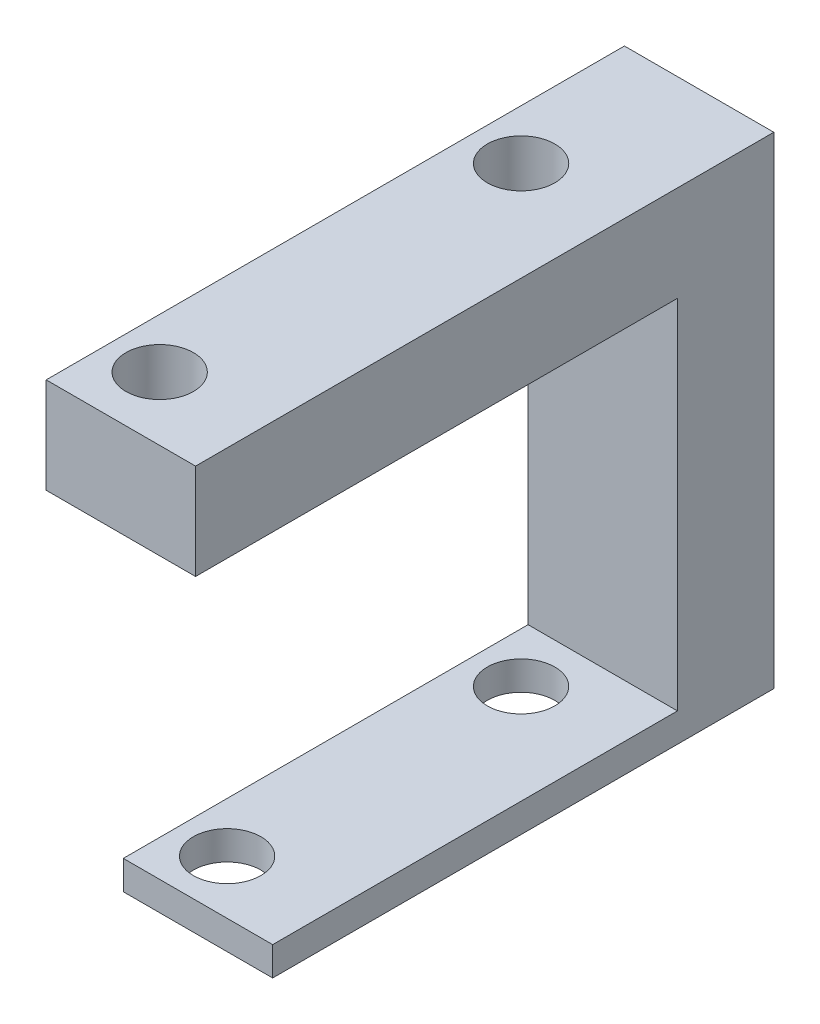
ISO-10303-21;
HEADER;
FILE_DESCRIPTION(('STEP AP214'),'2;1');
FILE_NAME('part.step','',(''),(''),'','','');
FILE_SCHEMA(('AUTOMOTIVE_DESIGN { 1 0 10303 214 1 1 1 1 }'));
ENDSEC;
DATA;
#1=APPLICATION_CONTEXT('core data for automotive mechanical design processes');
#2=APPLICATION_PROTOCOL_DEFINITION('international standard','automotive_design',2000,#1);
#3=PRODUCT_CONTEXT('',#1,'mechanical');
#4=PRODUCT('Part','Part','',(#3));
#5=PRODUCT_RELATED_PRODUCT_CATEGORY('part','',(#4));
#6=PRODUCT_DEFINITION_FORMATION('','',#4);
#7=PRODUCT_DEFINITION_CONTEXT('part definition',#1,'design');
#8=PRODUCT_DEFINITION('design','',#6,#7);
#9=PRODUCT_DEFINITION_SHAPE('','',#8);
#10=(LENGTH_UNIT() NAMED_UNIT(*) SI_UNIT(.MILLI.,.METRE.));
#11=(NAMED_UNIT(*) PLANE_ANGLE_UNIT() SI_UNIT($,.RADIAN.));
#12=(NAMED_UNIT(*) SI_UNIT($,.STERADIAN.) SOLID_ANGLE_UNIT());
#13=UNCERTAINTY_MEASURE_WITH_UNIT(LENGTH_MEASURE(1.E-05),#10,'distance_accuracy_value','');
#14=(GEOMETRIC_REPRESENTATION_CONTEXT(3) GLOBAL_UNCERTAINTY_ASSIGNED_CONTEXT((#13)) GLOBAL_UNIT_ASSIGNED_CONTEXT((#10,
#11,#12)) REPRESENTATION_CONTEXT('',''));
#15=CARTESIAN_POINT('',(0.,0.,0.));
#16=DIRECTION('',(0.,0.,1.));
#17=DIRECTION('',(1.,0.,0.));
#18=AXIS2_PLACEMENT_3D('',#15,#16,#17);
#19=CARTESIAN_POINT('',(-7.874,32.5993468484475,41.0275219428125));
#20=DIRECTION('',(0.,0.,1.));
#21=DIRECTION('',(1.,0.,0.));
#22=AXIS2_PLACEMENT_3D('',#19,#20,#21);
#23=PLANE('',#22);
#24=DIRECTION('',(0.,-1.,0.));
#25=VECTOR('',#24,1.);
#26=CARTESIAN_POINT('',(0.,32.5993468484475,41.0275219428125));
#27=LINE('',#26,#25);
#28=CARTESIAN_POINT('',(0.,32.5993468484475,41.0275219428125));
#29=VERTEX_POINT('',#28);
#30=CARTESIAN_POINT('',(0.,27.5582107378629,41.0275219428125));
#31=VERTEX_POINT('',#30);
#32=EDGE_CURVE('E130',#29,#31,#27,.T.);
#33=ORIENTED_EDGE('',*,*,#32,.F.);
#34=DIRECTION('',(1.,0.,0.));
#35=VECTOR('',#34,1.);
#36=CARTESIAN_POINT('',(-7.874,32.5993468484475,41.0275219428125));
#37=LINE('',#36,#35);
#38=CARTESIAN_POINT('',(-7.874,32.5993468484475,41.0275219428125));
#39=VERTEX_POINT('',#38);
#40=EDGE_CURVE('E11',#39,#29,#37,.T.);
#41=ORIENTED_EDGE('',*,*,#40,.F.);
#42=DIRECTION('',(0.,-1.,0.));
#43=VECTOR('',#42,1.);
#44=CARTESIAN_POINT('',(-7.874,32.5993468484475,41.0275219428125));
#45=LINE('',#44,#43);
#46=CARTESIAN_POINT('',(-7.874,27.5582107378629,41.0275219428125));
#47=VERTEX_POINT('',#46);
#48=EDGE_CURVE('E151',#39,#47,#45,.T.);
#49=ORIENTED_EDGE('',*,*,#48,.T.);
#50=DIRECTION('',(1.,0.,0.));
#51=VECTOR('',#50,1.);
#52=CARTESIAN_POINT('',(-7.874,27.5582107378629,41.0275219428125));
#53=LINE('',#52,#51);
#54=EDGE_CURVE('E88',#47,#31,#53,.T.);
#55=ORIENTED_EDGE('',*,*,#54,.T.);
#56=EDGE_LOOP('',(#33,#41,#49,#55));
#57=FACE_BOUND('',#56,.T.);
#58=ADVANCED_FACE('F32',(#57),#23,.T.);
#59=CARTESIAN_POINT('',(-7.874,32.5993468484475,41.0275219428125));
#60=DIRECTION('',(0.,1.,0.));
#61=DIRECTION('',(0.,0.,1.));
#62=AXIS2_PLACEMENT_3D('',#59,#60,#61);
#63=PLANE('',#62);
#64=CARTESIAN_POINT('',(-5.23875000000036,32.5993468484475,18.6310719428101));
#65=DIRECTION('',(0.,1.,0.));
#66=DIRECTION('',(0.,0.,1.));
#67=AXIS2_PLACEMENT_3D('',#64,#65,#66);
#68=CIRCLE('',#67,1.778);
#69=CARTESIAN_POINT('',(-5.23875000000036,32.5993468484475,20.4090719428101));
#70=VERTEX_POINT('',#69);
#71=EDGE_CURVE('E170',#70,#70,#68,.T.);
#72=ORIENTED_EDGE('',*,*,#71,.F.);
#73=EDGE_LOOP('',(#72));
#74=FACE_BOUND('',#73,.T.);
#75=CARTESIAN_POINT('',(-5.23875000000036,32.5993468484475,37.6810719428101));
#76=DIRECTION('',(0.,1.,0.));
#77=DIRECTION('',(0.,0.,1.));
#78=AXIS2_PLACEMENT_3D('',#75,#76,#77);
#79=CIRCLE('',#78,1.778);
#80=CARTESIAN_POINT('',(-5.23875000000036,32.5993468484475,39.4590719428101));
#81=VERTEX_POINT('',#80);
#82=EDGE_CURVE('E175',#81,#81,#79,.T.);
#83=ORIENTED_EDGE('',*,*,#82,.F.);
#84=EDGE_LOOP('',(#83));
#85=FACE_BOUND('',#84,.T.);
#86=DIRECTION('',(0.,0.,1.));
#87=VECTOR('',#86,1.);
#88=CARTESIAN_POINT('',(0.,32.5993468484475,41.0275219428125));
#89=LINE('',#88,#87);
#90=CARTESIAN_POINT('',(0.,32.5993468484475,10.5475219428125));
#91=VERTEX_POINT('',#90);
#92=EDGE_CURVE('E149',#91,#29,#89,.T.);
#93=ORIENTED_EDGE('',*,*,#92,.F.);
#94=DIRECTION('',(1.,0.,0.));
#95=VECTOR('',#94,1.);
#96=CARTESIAN_POINT('',(-7.874,32.5993468484475,10.5475219428125));
#97=LINE('',#96,#95);
#98=CARTESIAN_POINT('',(-7.874,32.5993468484475,10.5475219428125));
#99=VERTEX_POINT('',#98);
#100=EDGE_CURVE('E41',#99,#91,#97,.T.);
#101=ORIENTED_EDGE('',*,*,#100,.F.);
#102=DIRECTION('',(0.,0.,1.));
#103=VECTOR('',#102,1.);
#104=CARTESIAN_POINT('',(-7.874,32.5993468484475,41.0275219428125));
#105=LINE('',#104,#103);
#106=EDGE_CURVE('E120',#99,#39,#105,.T.);
#107=ORIENTED_EDGE('',*,*,#106,.T.);
#108=ORIENTED_EDGE('',*,*,#40,.T.);
#109=EDGE_LOOP('',(#93,#101,#107,#108));
#110=FACE_BOUND('',#109,.T.);
#111=ADVANCED_FACE('F204',(#74,#85,#110),#63,.T.);
#112=CARTESIAN_POINT('',(-7.874,32.5993468484475,10.5475219428125));
#113=DIRECTION('',(0.,0.,-1.));
#114=DIRECTION('',(0.,1.,0.));
#115=AXIS2_PLACEMENT_3D('',#112,#113,#114);
#116=PLANE('',#115);
#117=DIRECTION('',(0.,1.,0.));
#118=VECTOR('',#117,1.);
#119=CARTESIAN_POINT('',(0.,32.5993468484475,10.5475219428125));
#120=LINE('',#119,#118);
#121=CARTESIAN_POINT('',(0.,7.19934684844752,10.5475219428125));
#122=VERTEX_POINT('',#121);
#123=EDGE_CURVE('E107',#122,#91,#120,.T.);
#124=ORIENTED_EDGE('',*,*,#123,.F.);
#125=DIRECTION('',(1.,0.,0.));
#126=VECTOR('',#125,1.);
#127=CARTESIAN_POINT('',(-7.874,7.19934684844752,10.5475219428125));
#128=LINE('',#127,#126);
#129=CARTESIAN_POINT('',(-7.874,7.19934684844752,10.5475219428125));
#130=VERTEX_POINT('',#129);
#131=EDGE_CURVE('E102',#130,#122,#128,.T.);
#132=ORIENTED_EDGE('',*,*,#131,.F.);
#133=DIRECTION('',(0.,1.,0.));
#134=VECTOR('',#133,1.);
#135=CARTESIAN_POINT('',(-7.874,32.5993468484475,10.5475219428125));
#136=LINE('',#135,#134);
#137=EDGE_CURVE('E105',#130,#99,#136,.T.);
#138=ORIENTED_EDGE('',*,*,#137,.T.);
#139=ORIENTED_EDGE('',*,*,#100,.T.);
#140=EDGE_LOOP('',(#124,#132,#138,#139));
#141=FACE_BOUND('',#140,.T.);
#142=ADVANCED_FACE('F104',(#141),#116,.T.);
#143=CARTESIAN_POINT('',(-7.874,7.19934684844752,10.5475219428125));
#144=DIRECTION('',(0.,-1.,0.));
#145=DIRECTION('',(0.,0.,-1.));
#146=AXIS2_PLACEMENT_3D('',#143,#144,#145);
#147=PLANE('',#146);
#148=CARTESIAN_POINT('',(-5.23875000000036,7.19934684844752,18.6310719428101));
#149=DIRECTION('',(0.,-1.,0.));
#150=DIRECTION('',(0.,0.,-1.));
#151=AXIS2_PLACEMENT_3D('',#148,#149,#150);
#152=CIRCLE('',#151,1.778);
#153=CARTESIAN_POINT('',(-5.23875000000036,7.19934684844752,16.8530719428101));
#154=VERTEX_POINT('',#153);
#155=EDGE_CURVE('E134',#154,#154,#152,.F.);
#156=ORIENTED_EDGE('',*,*,#155,.T.);
#157=EDGE_LOOP('',(#156));
#158=FACE_BOUND('',#157,.T.);
#159=CARTESIAN_POINT('',(-5.23875000000036,7.19934684844752,34.1250719428101));
#160=DIRECTION('',(0.,-1.,0.));
#161=DIRECTION('',(0.,0.,-1.));
#162=AXIS2_PLACEMENT_3D('',#159,#160,#161);
#163=CIRCLE('',#162,1.778);
#164=CARTESIAN_POINT('',(-5.23875000000036,7.19934684844752,32.3470719428101));
#165=VERTEX_POINT('',#164);
#166=EDGE_CURVE('E165',#165,#165,#163,.F.);
#167=ORIENTED_EDGE('',*,*,#166,.T.);
#168=EDGE_LOOP('',(#167));
#169=FACE_BOUND('',#168,.T.);
#170=DIRECTION('',(0.,0.,-1.));
#171=VECTOR('',#170,1.);
#172=CARTESIAN_POINT('',(0.,7.19934684844752,10.5475219428125));
#173=LINE('',#172,#171);
#174=CARTESIAN_POINT('',(0.,7.19934684844752,36.9635219428125));
#175=VERTEX_POINT('',#174);
#176=EDGE_CURVE('E146',#175,#122,#173,.T.);
#177=ORIENTED_EDGE('',*,*,#176,.F.);
#178=DIRECTION('',(1.,0.,0.));
#179=VECTOR('',#178,1.);
#180=CARTESIAN_POINT('',(-7.874,7.19934684844752,36.9635219428125));
#181=LINE('',#180,#179);
#182=CARTESIAN_POINT('',(-7.874,7.19934684844752,36.9635219428125));
#183=VERTEX_POINT('',#182);
#184=EDGE_CURVE('E112',#183,#175,#181,.T.);
#185=ORIENTED_EDGE('',*,*,#184,.F.);
#186=DIRECTION('',(0.,0.,-1.));
#187=VECTOR('',#186,1.);
#188=CARTESIAN_POINT('',(-7.874,7.19934684844752,10.5475219428125));
#189=LINE('',#188,#187);
#190=EDGE_CURVE('E118',#183,#130,#189,.T.);
#191=ORIENTED_EDGE('',*,*,#190,.T.);
#192=ORIENTED_EDGE('',*,*,#131,.T.);
#193=EDGE_LOOP('',(#177,#185,#191,#192));
#194=FACE_BOUND('',#193,.T.);
#195=ADVANCED_FACE('F122',(#158,#169,#194),#147,.T.);
#196=CARTESIAN_POINT('',(-7.874,7.19934684844752,36.9635219428125));
#197=DIRECTION('',(0.,0.,1.));
#198=DIRECTION('',(1.,0.,0.));
#199=AXIS2_PLACEMENT_3D('',#196,#197,#198);
#200=PLANE('',#199);
#201=DIRECTION('',(0.,-1.,0.));
#202=VECTOR('',#201,1.);
#203=CARTESIAN_POINT('',(0.,7.19934684844752,36.9635219428125));
#204=LINE('',#203,#202);
#205=CARTESIAN_POINT('',(0.,8.72334684844752,36.9635219428125));
#206=VERTEX_POINT('',#205);
#207=EDGE_CURVE('E143',#206,#175,#204,.T.);
#208=ORIENTED_EDGE('',*,*,#207,.F.);
#209=DIRECTION('',(1.,0.,0.));
#210=VECTOR('',#209,1.);
#211=CARTESIAN_POINT('',(-7.874,8.72334684844752,36.9635219428125));
#212=LINE('',#211,#210);
#213=CARTESIAN_POINT('',(-7.874,8.72334684844752,36.9635219428125));
#214=VERTEX_POINT('',#213);
#215=EDGE_CURVE('E155',#214,#206,#212,.T.);
#216=ORIENTED_EDGE('',*,*,#215,.F.);
#217=DIRECTION('',(0.,-1.,0.));
#218=VECTOR('',#217,1.);
#219=CARTESIAN_POINT('',(-7.874,7.19934684844752,36.9635219428125));
#220=LINE('',#219,#218);
#221=EDGE_CURVE('E123',#214,#183,#220,.T.);
#222=ORIENTED_EDGE('',*,*,#221,.T.);
#223=ORIENTED_EDGE('',*,*,#184,.T.);
#224=EDGE_LOOP('',(#208,#216,#222,#223));
#225=FACE_BOUND('',#224,.T.);
#226=ADVANCED_FACE('F219',(#225),#200,.T.);
#227=CARTESIAN_POINT('',(-7.874,8.72334684844752,15.6275219428125));
#228=DIRECTION('',(0.,1.,0.));
#229=DIRECTION('',(0.,0.,1.));
#230=AXIS2_PLACEMENT_3D('',#227,#228,#229);
#231=PLANE('',#230);
#232=CARTESIAN_POINT('',(-5.23875000000036,8.72334684844752,18.6310719428101));
#233=DIRECTION('',(0.,1.,0.));
#234=DIRECTION('',(0.,0.,1.));
#235=AXIS2_PLACEMENT_3D('',#232,#233,#234);
#236=CIRCLE('',#235,1.778);
#237=CARTESIAN_POINT('',(-5.23875000000036,8.72334684844752,20.4090719428101));
#238=VERTEX_POINT('',#237);
#239=EDGE_CURVE('E166',#238,#238,#236,.F.);
#240=ORIENTED_EDGE('',*,*,#239,.T.);
#241=EDGE_LOOP('',(#240));
#242=FACE_BOUND('',#241,.T.);
#243=CARTESIAN_POINT('',(-5.23875000000036,8.72334684844752,34.1250719428101));
#244=DIRECTION('',(0.,1.,0.));
#245=DIRECTION('',(0.,0.,1.));
#246=AXIS2_PLACEMENT_3D('',#243,#244,#245);
#247=CIRCLE('',#246,1.778);
#248=CARTESIAN_POINT('',(-5.23875000000036,8.72334684844752,35.9030719428101));
#249=VERTEX_POINT('',#248);
#250=EDGE_CURVE('E162',#249,#249,#247,.F.);
#251=ORIENTED_EDGE('',*,*,#250,.T.);
#252=EDGE_LOOP('',(#251));
#253=FACE_BOUND('',#252,.T.);
#254=DIRECTION('',(0.,0.,1.));
#255=VECTOR('',#254,1.);
#256=CARTESIAN_POINT('',(0.,8.72334684844752,15.6275219428125));
#257=LINE('',#256,#255);
#258=CARTESIAN_POINT('',(0.,8.72334684844752,15.6275219428125));
#259=VERTEX_POINT('',#258);
#260=EDGE_CURVE('E140',#259,#206,#257,.T.);
#261=ORIENTED_EDGE('',*,*,#260,.F.);
#262=DIRECTION('',(1.,0.,0.));
#263=VECTOR('',#262,1.);
#264=CARTESIAN_POINT('',(-7.874,8.72334684844752,15.6275219428125));
#265=LINE('',#264,#263);
#266=CARTESIAN_POINT('',(-7.874,8.72334684844752,15.6275219428125));
#267=VERTEX_POINT('',#266);
#268=EDGE_CURVE('E157',#267,#259,#265,.T.);
#269=ORIENTED_EDGE('',*,*,#268,.F.);
#270=DIRECTION('',(0.,0.,1.));
#271=VECTOR('',#270,1.);
#272=CARTESIAN_POINT('',(-7.874,8.72334684844752,15.6275219428125));
#273=LINE('',#272,#271);
#274=EDGE_CURVE('E125',#267,#214,#273,.T.);
#275=ORIENTED_EDGE('',*,*,#274,.T.);
#276=ORIENTED_EDGE('',*,*,#215,.T.);
#277=EDGE_LOOP('',(#261,#269,#275,#276));
#278=FACE_BOUND('',#277,.T.);
#279=ADVANCED_FACE('F195',(#242,#253,#278),#231,.T.);
#280=CARTESIAN_POINT('',(-7.874,27.5582107378629,15.6275219428125));
#281=DIRECTION('',(0.,0.,1.));
#282=DIRECTION('',(0.,-1.,0.));
#283=AXIS2_PLACEMENT_3D('',#280,#281,#282);
#284=PLANE('',#283);
#285=DIRECTION('',(0.,-1.,0.));
#286=VECTOR('',#285,1.);
#287=CARTESIAN_POINT('',(0.,27.5582107378629,15.6275219428125));
#288=LINE('',#287,#286);
#289=CARTESIAN_POINT('',(0.,27.5582107378629,15.6275219428125));
#290=VERTEX_POINT('',#289);
#291=EDGE_CURVE('E137',#290,#259,#288,.T.);
#292=ORIENTED_EDGE('',*,*,#291,.F.);
#293=DIRECTION('',(1.,0.,0.));
#294=VECTOR('',#293,1.);
#295=CARTESIAN_POINT('',(-7.874,27.5582107378629,15.6275219428125));
#296=LINE('',#295,#294);
#297=CARTESIAN_POINT('',(-7.874,27.5582107378629,15.6275219428125));
#298=VERTEX_POINT('',#297);
#299=EDGE_CURVE('E159',#298,#290,#296,.T.);
#300=ORIENTED_EDGE('',*,*,#299,.F.);
#301=DIRECTION('',(0.,-1.,0.));
#302=VECTOR('',#301,1.);
#303=CARTESIAN_POINT('',(-7.874,27.5582107378629,15.6275219428125));
#304=LINE('',#303,#302);
#305=EDGE_CURVE('E189',#298,#267,#304,.T.);
#306=ORIENTED_EDGE('',*,*,#305,.T.);
#307=ORIENTED_EDGE('',*,*,#268,.T.);
#308=EDGE_LOOP('',(#292,#300,#306,#307));
#309=FACE_BOUND('',#308,.T.);
#310=ADVANCED_FACE('F200',(#309),#284,.T.);
#311=CARTESIAN_POINT('',(-7.874,27.5582107378629,41.0275219428125));
#312=DIRECTION('',(0.,-1.,0.));
#313=DIRECTION('',(0.,0.,-1.));
#314=AXIS2_PLACEMENT_3D('',#311,#312,#313);
#315=PLANE('',#314);
#316=CARTESIAN_POINT('',(-5.23875000000036,27.5582107378629,18.6310719428101));
#317=DIRECTION('',(0.,-1.,0.));
#318=DIRECTION('',(0.,0.,-1.));
#319=AXIS2_PLACEMENT_3D('',#316,#317,#318);
#320=CIRCLE('',#319,1.778);
#321=CARTESIAN_POINT('',(-5.23875000000036,27.5582107378629,16.8530719428101));
#322=VERTEX_POINT('',#321);
#323=EDGE_CURVE('E35',#322,#322,#320,.T.);
#324=ORIENTED_EDGE('',*,*,#323,.F.);
#325=EDGE_LOOP('',(#324));
#326=FACE_BOUND('',#325,.T.);
#327=CARTESIAN_POINT('',(-5.23875000000036,27.5582107378629,37.6810719428101));
#328=DIRECTION('',(0.,-1.,0.));
#329=DIRECTION('',(0.,0.,-1.));
#330=AXIS2_PLACEMENT_3D('',#327,#328,#329);
#331=CIRCLE('',#330,1.778);
#332=CARTESIAN_POINT('',(-5.23875000000036,27.5582107378629,35.9030719428101));
#333=VERTEX_POINT('',#332);
#334=EDGE_CURVE('E168',#333,#333,#331,.T.);
#335=ORIENTED_EDGE('',*,*,#334,.F.);
#336=EDGE_LOOP('',(#335));
#337=FACE_BOUND('',#336,.T.);
#338=DIRECTION('',(0.,0.,-1.));
#339=VECTOR('',#338,1.);
#340=CARTESIAN_POINT('',(0.,27.5582107378629,41.0275219428125));
#341=LINE('',#340,#339);
#342=EDGE_CURVE('E133',#31,#290,#341,.T.);
#343=ORIENTED_EDGE('',*,*,#342,.F.);
#344=ORIENTED_EDGE('',*,*,#54,.F.);
#345=DIRECTION('',(0.,0.,-1.));
#346=VECTOR('',#345,1.);
#347=CARTESIAN_POINT('',(-7.874,27.5582107378629,41.0275219428125));
#348=LINE('',#347,#346);
#349=EDGE_CURVE('E187',#47,#298,#348,.T.);
#350=ORIENTED_EDGE('',*,*,#349,.T.);
#351=ORIENTED_EDGE('',*,*,#299,.T.);
#352=EDGE_LOOP('',(#343,#344,#350,#351));
#353=FACE_BOUND('',#352,.T.);
#354=ADVANCED_FACE('F201',(#326,#337,#353),#315,.T.);
#355=CARTESIAN_POINT('',(-7.874,0.,0.));
#356=DIRECTION('',(1.,0.,0.));
#357=DIRECTION('',(0.,0.,-1.));
#358=AXIS2_PLACEMENT_3D('',#355,#356,#357);
#359=PLANE('',#358);
#360=ORIENTED_EDGE('',*,*,#48,.F.);
#361=ORIENTED_EDGE('',*,*,#106,.F.);
#362=ORIENTED_EDGE('',*,*,#137,.F.);
#363=ORIENTED_EDGE('',*,*,#190,.F.);
#364=ORIENTED_EDGE('',*,*,#221,.F.);
#365=ORIENTED_EDGE('',*,*,#274,.F.);
#366=ORIENTED_EDGE('',*,*,#305,.F.);
#367=ORIENTED_EDGE('',*,*,#349,.F.);
#368=EDGE_LOOP('',(#360,#361,#362,#363,#364,#365,#366,#367));
#369=FACE_BOUND('',#368,.T.);
#370=ADVANCED_FACE('F116',(#369),#359,.F.);
#371=CARTESIAN_POINT('',(0.,0.,0.));
#372=DIRECTION('',(1.,0.,0.));
#373=DIRECTION('',(0.,0.,-1.));
#374=AXIS2_PLACEMENT_3D('',#371,#372,#373);
#375=PLANE('',#374);
#376=ORIENTED_EDGE('',*,*,#32,.T.);
#377=ORIENTED_EDGE('',*,*,#342,.T.);
#378=ORIENTED_EDGE('',*,*,#291,.T.);
#379=ORIENTED_EDGE('',*,*,#260,.T.);
#380=ORIENTED_EDGE('',*,*,#207,.T.);
#381=ORIENTED_EDGE('',*,*,#176,.T.);
#382=ORIENTED_EDGE('',*,*,#123,.T.);
#383=ORIENTED_EDGE('',*,*,#92,.T.);
#384=EDGE_LOOP('',(#376,#377,#378,#379,#380,#381,#382,#383));
#385=FACE_BOUND('',#384,.T.);
#386=ADVANCED_FACE('F203',(#385),#375,.T.);
#387=CARTESIAN_POINT('',(-5.23875000000036,20.828,34.1250719428101));
#388=DIRECTION('',(0.,-1.,0.));
#389=DIRECTION('',(0.,0.,-1.));
#390=AXIS2_PLACEMENT_3D('',#387,#388,#389);
#391=CYLINDRICAL_SURFACE('',#390,1.778);
#392=ORIENTED_EDGE('',*,*,#166,.F.);
#393=EDGE_LOOP('',(#392));
#394=FACE_BOUND('',#393,.T.);
#395=ORIENTED_EDGE('',*,*,#250,.F.);
#396=EDGE_LOOP('',(#395));
#397=FACE_BOUND('',#396,.T.);
#398=ADVANCED_FACE('F248',(#394,#397),#391,.F.);
#399=CARTESIAN_POINT('',(-5.23875000000036,20.828,18.6310719428101));
#400=DIRECTION('',(0.,-1.,0.));
#401=DIRECTION('',(0.,0.,-1.));
#402=AXIS2_PLACEMENT_3D('',#399,#400,#401);
#403=CYLINDRICAL_SURFACE('',#402,1.778);
#404=ORIENTED_EDGE('',*,*,#155,.F.);
#405=EDGE_LOOP('',(#404));
#406=FACE_BOUND('',#405,.T.);
#407=ORIENTED_EDGE('',*,*,#239,.F.);
#408=EDGE_LOOP('',(#407));
#409=FACE_BOUND('',#408,.T.);
#410=ADVANCED_FACE('F243',(#406,#409),#403,.F.);
#411=CARTESIAN_POINT('',(-5.23875000000036,26.2493468484475,37.6810719428101));
#412=DIRECTION('',(0.,1.,0.));
#413=DIRECTION('',(0.,0.,1.));
#414=AXIS2_PLACEMENT_3D('',#411,#412,#413);
#415=CYLINDRICAL_SURFACE('',#414,1.778);
#416=ORIENTED_EDGE('',*,*,#334,.T.);
#417=EDGE_LOOP('',(#416));
#418=FACE_BOUND('',#417,.T.);
#419=ORIENTED_EDGE('',*,*,#82,.T.);
#420=EDGE_LOOP('',(#419));
#421=FACE_BOUND('',#420,.T.);
#422=ADVANCED_FACE('F238',(#418,#421),#415,.F.);
#423=CARTESIAN_POINT('',(-5.23875000000036,26.2493468484475,18.6310719428101));
#424=DIRECTION('',(0.,1.,0.));
#425=DIRECTION('',(0.,0.,1.));
#426=AXIS2_PLACEMENT_3D('',#423,#424,#425);
#427=CYLINDRICAL_SURFACE('',#426,1.778);
#428=ORIENTED_EDGE('',*,*,#323,.T.);
#429=EDGE_LOOP('',(#428));
#430=FACE_BOUND('',#429,.T.);
#431=ORIENTED_EDGE('',*,*,#71,.T.);
#432=EDGE_LOOP('',(#431));
#433=FACE_BOUND('',#432,.T.);
#434=ADVANCED_FACE('F236',(#430,#433),#427,.F.);
#435=CLOSED_SHELL('',(#58,#111,#142,#195,#226,#279,#310,#354,#370,#386,#398,#410,#422,#434));
#436=MANIFOLD_SOLID_BREP('B2',#435);
#437=ADVANCED_BREP_SHAPE_REPRESENTATION('',(#18,#436),#14);
#438=SHAPE_DEFINITION_REPRESENTATION(#9,#437);
ENDSEC;
END-ISO-10303-21;
